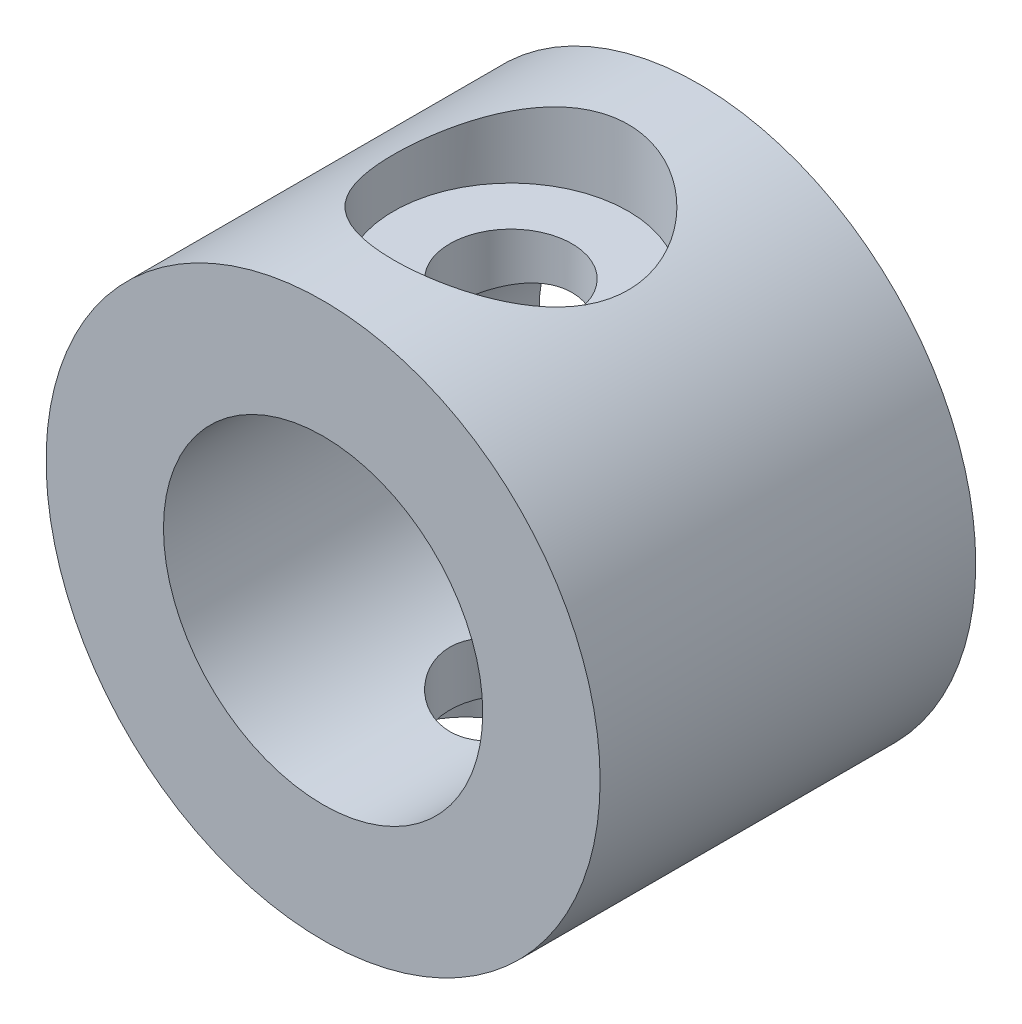
ISO-10303-21;
HEADER;
FILE_DESCRIPTION(('STEP AP214'),'2;1');
FILE_NAME('part.step','',(''),(''),'','','');
FILE_SCHEMA(('AUTOMOTIVE_DESIGN { 1 0 10303 214 1 1 1 1 }'));
ENDSEC;
DATA;
#1=APPLICATION_CONTEXT('core data for automotive mechanical design processes');
#2=APPLICATION_PROTOCOL_DEFINITION('international standard','automotive_design',2000,#1);
#3=PRODUCT_CONTEXT('',#1,'mechanical');
#4=PRODUCT('Part','Part','',(#3));
#5=PRODUCT_RELATED_PRODUCT_CATEGORY('part','',(#4));
#6=PRODUCT_DEFINITION_FORMATION('','',#4);
#7=PRODUCT_DEFINITION_CONTEXT('part definition',#1,'design');
#8=PRODUCT_DEFINITION('design','',#6,#7);
#9=PRODUCT_DEFINITION_SHAPE('','',#8);
#10=(LENGTH_UNIT() NAMED_UNIT(*) SI_UNIT(.MILLI.,.METRE.));
#11=(NAMED_UNIT(*) PLANE_ANGLE_UNIT() SI_UNIT($,.RADIAN.));
#12=(NAMED_UNIT(*) SI_UNIT($,.STERADIAN.) SOLID_ANGLE_UNIT());
#13=UNCERTAINTY_MEASURE_WITH_UNIT(LENGTH_MEASURE(1.E-05),#10,'distance_accuracy_value','');
#14=(GEOMETRIC_REPRESENTATION_CONTEXT(3) GLOBAL_UNCERTAINTY_ASSIGNED_CONTEXT((#13)) GLOBAL_UNIT_ASSIGNED_CONTEXT((#10,
#11,#12)) REPRESENTATION_CONTEXT('',''));
#15=CARTESIAN_POINT('',(0.,0.,0.));
#16=DIRECTION('',(0.,0.,1.));
#17=DIRECTION('',(1.,0.,0.));
#18=AXIS2_PLACEMENT_3D('',#15,#16,#17);
#19=CARTESIAN_POINT('',(0.,0.,8.));
#20=DIRECTION('',(0.,0.,1.));
#21=DIRECTION('',(1.,0.,0.));
#22=AXIS2_PLACEMENT_3D('',#19,#20,#21);
#23=PLANE('',#22);
#24=CARTESIAN_POINT('',(0.,0.,8.));
#25=DIRECTION('',(0.,0.,1.));
#26=DIRECTION('',(1.,0.,0.));
#27=AXIS2_PLACEMENT_3D('',#24,#25,#26);
#28=CIRCLE('',#27,5.9);
#29=CARTESIAN_POINT('',(5.9,0.,8.));
#30=VERTEX_POINT('',#29);
#31=EDGE_CURVE('E48',#30,#30,#28,.T.);
#32=ORIENTED_EDGE('',*,*,#31,.T.);
#33=EDGE_LOOP('',(#32));
#34=FACE_BOUND('',#33,.T.);
#35=CARTESIAN_POINT('',(0.,0.,8.));
#36=DIRECTION('',(0.,0.,1.));
#37=DIRECTION('',(1.,0.,0.));
#38=AXIS2_PLACEMENT_3D('',#35,#36,#37);
#39=CIRCLE('',#38,3.4);
#40=CARTESIAN_POINT('',(3.4,0.,8.));
#41=VERTEX_POINT('',#40);
#42=EDGE_CURVE('E85',#41,#41,#39,.T.);
#43=ORIENTED_EDGE('',*,*,#42,.F.);
#44=EDGE_LOOP('',(#43));
#45=FACE_BOUND('',#44,.T.);
#46=ADVANCED_FACE('F31',(#34,#45),#23,.T.);
#47=CARTESIAN_POINT('',(0.,0.,0.));
#48=DIRECTION('',(0.,0.,1.));
#49=DIRECTION('',(1.,0.,0.));
#50=AXIS2_PLACEMENT_3D('',#47,#48,#49);
#51=PLANE('',#50);
#52=CARTESIAN_POINT('',(0.,0.,0.));
#53=DIRECTION('',(0.,0.,1.));
#54=DIRECTION('',(1.,0.,0.));
#55=AXIS2_PLACEMENT_3D('',#52,#53,#54);
#56=CIRCLE('',#55,5.9);
#57=CARTESIAN_POINT('',(5.9,0.,0.));
#58=VERTEX_POINT('',#57);
#59=EDGE_CURVE('E82',#58,#58,#56,.T.);
#60=ORIENTED_EDGE('',*,*,#59,.F.);
#61=EDGE_LOOP('',(#60));
#62=FACE_BOUND('',#61,.T.);
#63=CARTESIAN_POINT('',(0.,0.,0.));
#64=DIRECTION('',(0.,0.,1.));
#65=DIRECTION('',(1.,0.,0.));
#66=AXIS2_PLACEMENT_3D('',#63,#64,#65);
#67=CIRCLE('',#66,3.4);
#68=CARTESIAN_POINT('',(3.4,0.,0.));
#69=VERTEX_POINT('',#68);
#70=EDGE_CURVE('E88',#69,#69,#67,.T.);
#71=ORIENTED_EDGE('',*,*,#70,.T.);
#72=EDGE_LOOP('',(#71));
#73=FACE_BOUND('',#72,.T.);
#74=ADVANCED_FACE('F121',(#62,#73),#51,.F.);
#75=CARTESIAN_POINT('',(0.,0.,8.));
#76=DIRECTION('',(0.,0.,-1.));
#77=DIRECTION('',(-1.,0.,0.));
#78=AXIS2_PLACEMENT_3D('',#75,#76,#77);
#79=CYLINDRICAL_SURFACE('',#78,5.9);
#80=CARTESIAN_POINT('',(0.,-5.9,1.5));
#81=CARTESIAN_POINT('',(-0.133704964672586,-5.89999539975091,1.5000058234451));
#82=CARTESIAN_POINT('',(-0.267638901281597,-5.89540334321828,1.51078972456949));
#83=CARTESIAN_POINT('',(-0.531686826948365,-5.87749259551177,1.55351592543075));
#84=CARTESIAN_POINT('',(-0.661790144428239,-5.86415156573512,1.58551238913156));
#85=CARTESIAN_POINT('',(-0.913940644210926,-5.83016639965286,1.6692718372477));
#86=CARTESIAN_POINT('',(-1.03601382516124,-5.80954736341634,1.7209669340223));
#87=CARTESIAN_POINT('',(-1.26963264405531,-5.76300612955336,1.8423682881944));
#88=CARTESIAN_POINT('',(-1.38118125916974,-5.73708543826198,1.91206943109243));
#89=CARTESIAN_POINT('',(-1.59651817106512,-5.68102879724399,2.07129714951707));
#90=CARTESIAN_POINT('',(-1.69969303104001,-5.65075176642193,2.16160321480173));
#91=CARTESIAN_POINT('',(-1.8899640072564,-5.58999386580978,2.35782752695448));
#92=CARTESIAN_POINT('',(-1.97705138747107,-5.55951289452794,2.46375420050925));
#93=CARTESIAN_POINT('',(-2.13709462619903,-5.50004505417565,2.69479354640178));
#94=CARTESIAN_POINT('',(-2.20909662973242,-5.47121499310551,2.82061159365557));
#95=CARTESIAN_POINT('',(-2.33064116406356,-5.42056083698699,3.08396940474092));
#96=CARTESIAN_POINT('',(-2.3801956541013,-5.39873301320789,3.22150288049487));
#97=CARTESIAN_POINT('',(-2.45288327698176,-5.36608701412312,3.49732548254046));
#98=CARTESIAN_POINT('',(-2.47719925100343,-5.35477882345067,3.63524260936203));
#99=CARTESIAN_POINT('',(-2.5024073197555,-5.34304891755339,3.91362722151472));
#100=CARTESIAN_POINT('',(-2.50331297556624,-5.34262089968713,4.05409318316441));
#101=CARTESIAN_POINT('',(-2.48256336049047,-5.35228644659235,4.32161617055171));
#102=CARTESIAN_POINT('',(-2.4627025809086,-5.36154316291892,4.44884877806482));
#103=CARTESIAN_POINT('',(-2.40400167454297,-5.3881168191821,4.69796842300373));
#104=CARTESIAN_POINT('',(-2.36515776468436,-5.40543536569708,4.81985438963963));
#105=CARTESIAN_POINT('',(-2.26883070129111,-5.44657603145346,5.05795253178553));
#106=CARTESIAN_POINT('',(-2.21096284909565,-5.47053062034435,5.17398514823833));
#107=CARTESIAN_POINT('',(-2.07850355612712,-5.52221598600458,5.39515439056438));
#108=CARTESIAN_POINT('',(-2.00390539673649,-5.54994827807618,5.50028661414626));
#109=CARTESIAN_POINT('',(-1.83242814186108,-5.60902122141942,5.70637377125554));
#110=CARTESIAN_POINT('',(-1.73416890140161,-5.64046504739879,5.80615409100292));
#111=CARTESIAN_POINT('',(-1.52201112840676,-5.70137305807578,5.98822222337428));
#112=CARTESIAN_POINT('',(-1.40810869165618,-5.73083674582958,6.07050565603506));
#113=CARTESIAN_POINT('',(-1.16422417889566,-5.78537407482597,6.21704782637199));
#114=CARTESIAN_POINT('',(-1.03391535889474,-5.81032182708302,6.28081312152926));
#115=CARTESIAN_POINT('',(-0.763092580703262,-5.85204339288472,6.385101847547));
#116=CARTESIAN_POINT('',(-0.622584512442175,-5.86882188159139,6.42563857416719));
#117=CARTESIAN_POINT('',(-0.3451544221524,-5.8914318291442,6.47982477505773));
#118=CARTESIAN_POINT('',(-0.208592262511964,-5.89790354286186,6.49504963467179));
#119=CARTESIAN_POINT('',(0.0652785683328544,-5.90122613678829,6.50289606265336));
#120=CARTESIAN_POINT('',(0.202587003487469,-5.89807990040911,6.49552440533877));
#121=CARTESIAN_POINT('',(0.466571516947615,-5.88293333586752,6.45950083022525));
#122=CARTESIAN_POINT('',(0.593430264007493,-5.87139920919387,6.43196889052793));
#123=CARTESIAN_POINT('',(0.840580673605039,-5.84114161827264,6.35798023578657));
#124=CARTESIAN_POINT('',(0.960871511531733,-5.82241725363961,6.31152115057818));
#125=CARTESIAN_POINT('',(1.19571108463385,-5.77883981744612,6.19948403870959));
#126=CARTESIAN_POINT('',(1.30996384315592,-5.75381385946635,6.133355060361));
#127=CARTESIAN_POINT('',(1.52616176330887,-5.70028547490212,5.98445886906334));
#128=CARTESIAN_POINT('',(1.62810168521517,-5.67178157858135,5.90168461237042));
#129=CARTESIAN_POINT('',(1.82469243507812,-5.61175805661168,5.71470936436581));
#130=CARTESIAN_POINT('',(1.91825041996665,-5.58017109880818,5.60937802949427));
#131=CARTESIAN_POINT('',(2.08668313219431,-5.51940129227753,5.38403260799288));
#132=CARTESIAN_POINT('',(2.16155306403031,-5.4902190619068,5.26401476443815));
#133=CARTESIAN_POINT('',(2.29145182539148,-5.43730350588712,5.00991407421344));
#134=CARTESIAN_POINT('',(2.34613525687956,-5.4136673528999,4.87563290193898));
#135=CARTESIAN_POINT('',(2.43163459624991,-5.37581433799652,4.59844826890426));
#136=CARTESIAN_POINT('',(2.46247109552343,-5.36158935124716,4.45555236201639));
#137=CARTESIAN_POINT('',(2.49732222272223,-5.34543887503271,4.17736296483277));
#138=CARTESIAN_POINT('',(2.50326415604511,-5.34263012416882,4.04236126222007));
#139=CARTESIAN_POINT('',(2.49333867582406,-5.34726978836135,3.77335595645444));
#140=CARTESIAN_POINT('',(2.47747489636737,-5.3547164942686,3.63935219072956));
#141=CARTESIAN_POINT('',(2.42602534881031,-5.3782090327067,3.38303450658959));
#142=CARTESIAN_POINT('',(2.3914606094019,-5.39380836632267,3.26047073205028));
#143=CARTESIAN_POINT('',(2.30460795944894,-5.43148331538415,3.02286389499454));
#144=CARTESIAN_POINT('',(2.25231503396178,-5.45356076311825,2.90782297153598));
#145=CARTESIAN_POINT('',(2.12780712968082,-5.50337967886083,2.68083108100408));
#146=CARTESIAN_POINT('',(2.05456820548802,-5.53138522124817,2.56950082961975));
#147=CARTESIAN_POINT('',(1.89165766660172,-5.58919486091607,2.36010809150506));
#148=CARTESIAN_POINT('',(1.80198004622459,-5.61899961283883,2.26205047661063));
#149=CARTESIAN_POINT('',(1.6006003280644,-5.67978363034554,2.07427008859748));
#150=CARTESIAN_POINT('',(1.48773900159791,-5.71067865829118,1.98575646499252));
#151=CARTESIAN_POINT('',(1.24766991390656,-5.76788998412644,1.8288477260063));
#152=CARTESIAN_POINT('',(1.12045567757481,-5.7942042017274,1.76046174152596));
#153=CARTESIAN_POINT('',(0.85690908963206,-5.83893962786304,1.64714941197378));
#154=CARTESIAN_POINT('',(0.72074756489416,-5.85747627720416,1.60187761750309));
#155=CARTESIAN_POINT('',(0.511877530788227,-5.87817264520304,1.5519146910749));
#156=CARTESIAN_POINT('',(0.441544748382825,-5.88388481912997,1.53825519356756));
#157=CARTESIAN_POINT('',(0.299825804043617,-5.89280273435451,1.51701329464952));
#158=CARTESIAN_POINT('',(0.228440443174297,-5.89601029066881,1.50942649244964));
#159=CARTESIAN_POINT('',(0.130750752549894,-5.89860900890774,1.50328424318549));
#160=CARTESIAN_POINT('',(0.104619195254891,-5.8991301301922,1.50205327158543));
#161=CARTESIAN_POINT('',(0.0523280156759135,-5.8998260767358,1.50041057817083));
#162=CARTESIAN_POINT('',(0.0261683932591358,-5.90000090034897,1.49999886025024));
#163=CARTESIAN_POINT('',(0.,-5.9,1.5));
#164=B_SPLINE_CURVE_WITH_KNOTS('',3,(#80,#81,#82,#83,#84,#85,#86,#87,#88,#89,#90,#91,#92,#93,
#94,#95,#96,#97,#98,#99,#100,#101,#102,#103,#104,#105,#106,#107,#108,#109,#110,#111,#112,#113,
#114,#115,#116,#117,#118,#119,#120,#121,#122,#123,#124,#125,#126,#127,#128,#129,#130,#131,#132,
#133,#134,#135,#136,#137,#138,#139,#140,#141,#142,#143,#144,#145,#146,#147,#148,#149,#150,#151,
#152,#153,#154,#155,#156,#157,#158,#159,#160,#161,#162,#163),.UNSPECIFIED.,.T.,.F.,(4,2,2,2,2,2,
2,2,2,2,2,2,2,2,2,2,2,2,2,2,2,2,2,2,2,2,2,2,2,2,2,2,2,2,2,2,2,2,2,2,2,4),(0.,0.401012155218539,
0.803052215326141,1.20371907079431,1.60427224436101,2.0237016719916,2.44335819822093,
2.88453802682298,3.32548253320073,3.74467393752972,4.16362250809056,4.54914091507956,
4.93473618189443,5.32866517195721,5.72275264162534,6.1513957104709,6.58014595474843,
7.01944812402802,7.45849859008767,7.86903145748405,8.27944126130657,8.66863129555448,
9.05787008137065,9.45924509890238,9.86079032414974,10.291964162133,10.7232485292704,
11.1616033862626,11.5995793078789,12.0029386061657,12.406230689719,12.7894477096556,
13.1727732244579,13.5795745857473,13.9865248643927,14.4245663053443,14.8628061585292,
15.2942891263342,15.5096641286141,15.7248829102629,15.8033676092252,15.881852681228),.UNSPECIFIED.);
#165=CARTESIAN_POINT('',(0.,-5.9,1.5));
#166=VERTEX_POINT('',#165);
#167=EDGE_CURVE('E10',#166,#166,#164,.T.);
#168=ORIENTED_EDGE('',*,*,#167,.T.);
#169=EDGE_LOOP('',(#168));
#170=FACE_BOUND('',#169,.T.);
#171=CARTESIAN_POINT('',(0.,5.9,6.5));
#172=CARTESIAN_POINT('',(-0.133704964672586,5.89999539975091,6.4999941765549));
#173=CARTESIAN_POINT('',(-0.267638901281597,5.89540334321828,6.48921027543051));
#174=CARTESIAN_POINT('',(-0.531686826948365,5.87749259551178,6.44648407456925));
#175=CARTESIAN_POINT('',(-0.661790144428239,5.86415156573512,6.41448761086844));
#176=CARTESIAN_POINT('',(-0.913940644210926,5.83016639965286,6.3307281627523));
#177=CARTESIAN_POINT('',(-1.03601382516125,5.80954736341634,6.2790330659777));
#178=CARTESIAN_POINT('',(-1.26963264405531,5.76300612955336,6.1576317118056));
#179=CARTESIAN_POINT('',(-1.38118125916974,5.73708543826198,6.08793056890757));
#180=CARTESIAN_POINT('',(-1.59651817106511,5.68102879724399,5.92870285048293));
#181=CARTESIAN_POINT('',(-1.69969303104001,5.65075176642193,5.83839678519827));
#182=CARTESIAN_POINT('',(-1.8899640072564,5.58999386580978,5.64217247304552));
#183=CARTESIAN_POINT('',(-1.97705138747107,5.55951289452794,5.53624579949075));
#184=CARTESIAN_POINT('',(-2.13709462619903,5.50004505417565,5.30520645359822));
#185=CARTESIAN_POINT('',(-2.20909662973242,5.4712149931055,5.17938840634443));
#186=CARTESIAN_POINT('',(-2.33064116406356,5.42056083698699,4.91603059525908));
#187=CARTESIAN_POINT('',(-2.3801956541013,5.39873301320789,4.77849711950513));
#188=CARTESIAN_POINT('',(-2.45288327698176,5.36608701412312,4.50267451745954));
#189=CARTESIAN_POINT('',(-2.47719925100343,5.35477882345067,4.36475739063797));
#190=CARTESIAN_POINT('',(-2.50240731975551,5.34304891755339,4.08637277848528));
#191=CARTESIAN_POINT('',(-2.50331297556624,5.34262089968713,3.9459068168356));
#192=CARTESIAN_POINT('',(-2.48256336049047,5.35228644659235,3.67838382944829));
#193=CARTESIAN_POINT('',(-2.4627025809086,5.36154316291892,3.55115122193518));
#194=CARTESIAN_POINT('',(-2.40400167454297,5.38811681918209,3.30203157699628));
#195=CARTESIAN_POINT('',(-2.36515776468436,5.40543536569708,3.18014561036037));
#196=CARTESIAN_POINT('',(-2.26883070129111,5.44657603145346,2.94204746821447));
#197=CARTESIAN_POINT('',(-2.21096284909566,5.47053062034435,2.82601485176167));
#198=CARTESIAN_POINT('',(-2.07850355612713,5.52221598600458,2.60484560943563));
#199=CARTESIAN_POINT('',(-2.00390539673649,5.54994827807618,2.49971338585375));
#200=CARTESIAN_POINT('',(-1.83242814186109,5.60902122141942,2.29362622874446));
#201=CARTESIAN_POINT('',(-1.73416890140162,5.64046504739879,2.19384590899708));
#202=CARTESIAN_POINT('',(-1.52201112840676,5.70137305807578,2.01177777662572));
#203=CARTESIAN_POINT('',(-1.40810869165618,5.73083674582958,1.92949434396494));
#204=CARTESIAN_POINT('',(-1.16422417889567,5.78537407482596,1.78295217362802));
#205=CARTESIAN_POINT('',(-1.03391535889474,5.81032182708302,1.71918687847074));
#206=CARTESIAN_POINT('',(-0.763092580703267,5.85204339288472,1.614898152453));
#207=CARTESIAN_POINT('',(-0.62258451244218,5.86882188159138,1.57436142583281));
#208=CARTESIAN_POINT('',(-0.345154422152405,5.8914318291442,1.52017522494227));
#209=CARTESIAN_POINT('',(-0.208592262511968,5.89790354286186,1.50495036532821));
#210=CARTESIAN_POINT('',(0.0652785683328502,5.90122613678829,1.49710393734664));
#211=CARTESIAN_POINT('',(0.202587003487465,5.89807990040911,1.50447559466123));
#212=CARTESIAN_POINT('',(0.466571516947611,5.88293333586752,1.54049916977475));
#213=CARTESIAN_POINT('',(0.593430264007489,5.87139920919387,1.56803110947207));
#214=CARTESIAN_POINT('',(0.840580673605035,5.84114161827264,1.64201976421343));
#215=CARTESIAN_POINT('',(0.960871511531729,5.82241725363961,1.68847884942182));
#216=CARTESIAN_POINT('',(1.19571108463385,5.77883981744612,1.80051596129041));
#217=CARTESIAN_POINT('',(1.30996384315591,5.75381385946635,1.866644939639));
#218=CARTESIAN_POINT('',(1.52616176330887,5.70028547490213,2.01554113093666));
#219=CARTESIAN_POINT('',(1.62810168521517,5.67178157858135,2.09831538762958));
#220=CARTESIAN_POINT('',(1.82469243507812,5.61175805661168,2.28529063563419));
#221=CARTESIAN_POINT('',(1.91825041996665,5.58017109880819,2.39062197050573));
#222=CARTESIAN_POINT('',(2.08668313219431,5.51940129227753,2.61596739200712));
#223=CARTESIAN_POINT('',(2.16155306403031,5.4902190619068,2.73598523556185));
#224=CARTESIAN_POINT('',(2.29145182539148,5.43730350588712,2.99008592578656));
#225=CARTESIAN_POINT('',(2.34613525687955,5.4136673528999,3.12436709806102));
#226=CARTESIAN_POINT('',(2.43163459624991,5.37581433799653,3.40155173109573));
#227=CARTESIAN_POINT('',(2.46247109552342,5.36158935124717,3.5444476379836));
#228=CARTESIAN_POINT('',(2.49732222272223,5.34543887503271,3.82263703516723));
#229=CARTESIAN_POINT('',(2.50326415604511,5.34263012416882,3.95763873777992));
#230=CARTESIAN_POINT('',(2.49333867582406,5.34726978836135,4.22664404354556));
#231=CARTESIAN_POINT('',(2.47747489636737,5.3547164942686,4.36064780927044));
#232=CARTESIAN_POINT('',(2.42602534881031,5.3782090327067,4.61696549341041));
#233=CARTESIAN_POINT('',(2.3914606094019,5.39380836632267,4.73952926794972));
#234=CARTESIAN_POINT('',(2.30460795944894,5.43148331538415,4.97713610500546));
#235=CARTESIAN_POINT('',(2.25231503396178,5.45356076311824,5.09217702846402));
#236=CARTESIAN_POINT('',(2.12780712968082,5.50337967886083,5.31916891899592));
#237=CARTESIAN_POINT('',(2.05456820548802,5.53138522124817,5.43049917038024));
#238=CARTESIAN_POINT('',(1.89165766660172,5.58919486091607,5.63989190849494));
#239=CARTESIAN_POINT('',(1.80198004622459,5.61899961283883,5.73794952338937));
#240=CARTESIAN_POINT('',(1.6006003280644,5.67978363034553,5.92572991140252));
#241=CARTESIAN_POINT('',(1.48773900159792,5.71067865829118,6.01424353500748));
#242=CARTESIAN_POINT('',(1.24766991390657,5.76788998412644,6.1711522739937));
#243=CARTESIAN_POINT('',(1.12045567757482,5.7942042017274,6.23953825847404));
#244=CARTESIAN_POINT('',(0.856909089632063,5.83893962786304,6.35285058802622));
#245=CARTESIAN_POINT('',(0.720747564894164,5.85747627720416,6.39812238249691));
#246=CARTESIAN_POINT('',(0.511877530788231,5.87817264520304,6.44808530892509));
#247=CARTESIAN_POINT('',(0.441544748382828,5.88388481912997,6.46174480643244));
#248=CARTESIAN_POINT('',(0.29982580404362,5.89280273435451,6.48298670535047));
#249=CARTESIAN_POINT('',(0.2284404431743,5.89601029066881,6.49057350755036));
#250=CARTESIAN_POINT('',(0.130750752549895,5.89860900890774,6.49671575681451));
#251=CARTESIAN_POINT('',(0.104619195254891,5.8991301301922,6.49794672841457));
#252=CARTESIAN_POINT('',(0.0523280156759131,5.8998260767358,6.49958942182917));
#253=CARTESIAN_POINT('',(0.0261683932591356,5.90000090034897,6.50000113974976));
#254=CARTESIAN_POINT('',(0.,5.9,6.5));
#255=B_SPLINE_CURVE_WITH_KNOTS('',3,(#171,#172,#173,#174,#175,#176,#177,#178,#179,#180,#181,
#182,#183,#184,#185,#186,#187,#188,#189,#190,#191,#192,#193,#194,#195,#196,#197,#198,#199,#200,
#201,#202,#203,#204,#205,#206,#207,#208,#209,#210,#211,#212,#213,#214,#215,#216,#217,#218,#219,
#220,#221,#222,#223,#224,#225,#226,#227,#228,#229,#230,#231,#232,#233,#234,#235,#236,#237,#238,
#239,#240,#241,#242,#243,#244,#245,#246,#247,#248,#249,#250,#251,#252,#253,#254),.UNSPECIFIED.,
.T.,.F.,(4,2,2,2,2,2,2,2,2,2,2,2,2,2,2,2,2,2,2,2,2,2,2,2,2,2,2,2,2,2,2,2,2,2,2,2,2,2,2,2,2,4),
(0.,0.401012155218539,0.803052215326141,1.20371907079431,1.60427224436101,2.0237016719916,
2.44335819822093,2.88453802682298,3.32548253320073,3.74467393752972,4.16362250809056,
4.54914091507956,4.93473618189443,5.32866517195721,5.72275264162534,6.1513957104709,
6.58014595474842,7.01944812402802,7.45849859008767,7.86903145748405,8.27944126130657,
8.66863129555448,9.05787008137064,9.45924509890238,9.86079032414974,10.291964162133,
10.7232485292704,11.1616033862626,11.5995793078789,12.0029386061657,12.406230689719,
12.7894477096556,13.1727732244579,13.5795745857473,13.9865248643927,14.4245663053443,
14.8628061585292,15.2942891263342,15.5096641286141,15.7248829102629,15.8033676092252,
15.881852681228),.UNSPECIFIED.);
#256=CARTESIAN_POINT('',(0.,5.9,6.5));
#257=VERTEX_POINT('',#256);
#258=EDGE_CURVE('E44',#257,#257,#255,.T.);
#259=ORIENTED_EDGE('',*,*,#258,.T.);
#260=EDGE_LOOP('',(#259));
#261=FACE_BOUND('',#260,.T.);
#262=ORIENTED_EDGE('',*,*,#31,.F.);
#263=EDGE_LOOP('',(#262));
#264=FACE_BOUND('',#263,.T.);
#265=ORIENTED_EDGE('',*,*,#59,.T.);
#266=EDGE_LOOP('',(#265));
#267=FACE_BOUND('',#266,.T.);
#268=ADVANCED_FACE('F33',(#170,#261,#264,#267),#79,.T.);
#269=CARTESIAN_POINT('',(0.,0.,8.));
#270=DIRECTION('',(0.,0.,-1.));
#271=DIRECTION('',(-1.,0.,0.));
#272=AXIS2_PLACEMENT_3D('',#269,#270,#271);
#273=CYLINDRICAL_SURFACE('',#272,3.4);
#274=CARTESIAN_POINT('',(0.,-3.4,2.7));
#275=CARTESIAN_POINT('',(-0.0703050646487782,-3.40000227934561,2.69999699869852));
#276=CARTESIAN_POINT('',(-0.140590003338292,-3.39780060572003,2.70572089035486));
#277=CARTESIAN_POINT('',(-0.279054037846009,-3.38923843055045,2.72836818376442));
#278=CARTESIAN_POINT('',(-0.347233525044064,-3.38287870687431,2.74528949076654));
#279=CARTESIAN_POINT('',(-0.479469306737702,-3.36668145803788,2.78964206524634));
#280=CARTESIAN_POINT('',(-0.543533456836366,-3.35685080656631,2.8170525692609));
#281=CARTESIAN_POINT('',(-0.666147899344888,-3.3346864622569,2.88149766629924));
#282=CARTESIAN_POINT('',(-0.724696646983225,-3.32235207119741,2.91853494476607));
#283=CARTESIAN_POINT('',(-0.837188356258301,-3.29584409218327,3.00287834853146));
#284=CARTESIAN_POINT('',(-0.890857448130563,-3.28161704543611,3.05053277526407));
#285=CARTESIAN_POINT('',(-0.989664643642496,-3.25318491530425,3.15401834943847));
#286=CARTESIAN_POINT('',(-1.03479998366941,-3.23897984050712,3.20985213537091));
#287=CARTESIAN_POINT('',(-1.11703467519467,-3.21157136198829,3.33082761533339));
#288=CARTESIAN_POINT('',(-1.15374125477209,-3.198430590952,3.39625192368118));
#289=CARTESIAN_POINT('',(-1.21550770618724,-3.17547397060102,3.53292625834558));
#290=CARTESIAN_POINT('',(-1.24057243993588,-3.16565673376491,3.60417383808058));
#291=CARTESIAN_POINT('',(-1.27725272362803,-3.15103201967035,3.74731499052276));
#292=CARTESIAN_POINT('',(-1.2893924085612,-3.14603016499681,3.81905370648715));
#293=CARTESIAN_POINT('',(-1.30151647400042,-3.1410352202548,3.96371101409673));
#294=CARTESIAN_POINT('',(-1.30150613328424,-3.14103995499141,4.03662907958432));
#295=CARTESIAN_POINT('',(-1.28973014862173,-3.14589058202643,4.17671227883537));
#296=CARTESIAN_POINT('',(-1.27870056125351,-3.15043334409149,4.24395175921214));
#297=CARTESIAN_POINT('',(-1.24641901835421,-3.16334295223987,4.37554086321392));
#298=CARTESIAN_POINT('',(-1.2251654603917,-3.17171039776625,4.43989003210314));
#299=CARTESIAN_POINT('',(-1.17264886462995,-3.19150314293466,4.56534041052968));
#300=CARTESIAN_POINT('',(-1.14119985056895,-3.20298455368187,4.62635452166853));
#301=CARTESIAN_POINT('',(-1.06931493445421,-3.22769382291609,4.74244947732204));
#302=CARTESIAN_POINT('',(-1.0288758447385,-3.24092230019334,4.79752820698433));
#303=CARTESIAN_POINT('',(-0.936823017515743,-3.26876570685853,4.90425043495254));
#304=CARTESIAN_POINT('',(-0.884624716518553,-3.28341282687496,4.95538259018867));
#305=CARTESIAN_POINT('',(-0.772229005892806,-3.31164863920904,5.04832291279794));
#306=CARTESIAN_POINT('',(-0.712030270259958,-3.32523715547861,5.09012953145917));
#307=CARTESIAN_POINT('',(-0.583996294112149,-3.35011422813103,5.16382621877911));
#308=CARTESIAN_POINT('',(-0.516050624992801,-3.36136073817027,5.19553964890132));
#309=CARTESIAN_POINT('',(-0.375250881878489,-3.37997307907286,5.24691436902049));
#310=CARTESIAN_POINT('',(-0.302399095251245,-3.38734070444389,5.26658123286979));
#311=CARTESIAN_POINT('',(-0.158153708133313,-3.39704633753882,5.29230682477943));
#312=CARTESIAN_POINT('',(-0.0868998345367058,-3.3996383975945,5.29905372256457));
#313=CARTESIAN_POINT('',(0.0557612336850473,-3.40029030713716,5.30075980706295));
#314=CARTESIAN_POINT('',(0.127168388853128,-3.39835120920733,5.29572173141272));
#315=CARTESIAN_POINT('',(0.265093478293417,-3.39032598871475,5.2745192200597));
#316=CARTESIAN_POINT('',(0.331692500727122,-3.38441001998037,5.25881103593712));
#317=CARTESIAN_POINT('',(0.46125867742513,-3.36919852882021,5.21732071128405));
#318=CARTESIAN_POINT('',(0.524225359032764,-3.35990256771871,5.19153726309272));
#319=CARTESIAN_POINT('',(0.646844153331062,-3.33850020559823,5.12979862984385));
#320=CARTESIAN_POINT('',(0.706341620606955,-3.32631832323757,5.09356327956677));
#321=CARTESIAN_POINT('',(0.818614179324437,-3.30048405894327,5.0122643038403));
#322=CARTESIAN_POINT('',(0.871386709329985,-3.2868311203369,4.96719733103511));
#323=CARTESIAN_POINT('',(0.972045292174109,-3.25853121203601,4.86631725061357));
#324=CARTESIAN_POINT('',(1.01944430154119,-3.24387397478732,4.81001978122327));
#325=CARTESIAN_POINT('',(1.10422529352988,-3.21600430988262,4.68998936906212));
#326=CARTESIAN_POINT('',(1.14160617811259,-3.20279204069652,4.62625561233323));
#327=CARTESIAN_POINT('',(1.20538021904045,-3.17934357038346,4.49251826435898));
#328=CARTESIAN_POINT('',(1.2317104061072,-3.16912452235714,4.42248143133641));
#329=CARTESIAN_POINT('',(1.27202148933743,-3.1531635589904,4.27846550389432));
#330=CARTESIAN_POINT('',(1.28601044224104,-3.14741872303323,4.20448901490691));
#331=CARTESIAN_POINT('',(1.30050711872048,-3.14145458065056,4.0599944860929));
#332=CARTESIAN_POINT('',(1.3018496087557,-3.14089317942914,3.98957367186106));
#333=CARTESIAN_POINT('',(1.29316938914673,-3.14447684950244,3.84956489455342));
#334=CARTESIAN_POINT('',(1.28314784863686,-3.14862143664396,3.77997684654668));
#335=CARTESIAN_POINT('',(1.25268356358223,-3.16086030110073,3.64594643007232));
#336=CARTESIAN_POINT('',(1.2325955919435,-3.16881974053606,3.58141003757476));
#337=CARTESIAN_POINT('',(1.18288664271686,-3.18770805174523,3.45658914355378));
#338=CARTESIAN_POINT('',(1.1532632115154,-3.19863768768132,3.39630574125986));
#339=CARTESIAN_POINT('',(1.08347390185794,-3.2229672825809,3.27816792125006));
#340=CARTESIAN_POINT('',(1.04282594140104,-3.23646862260719,3.22061944803615));
#341=CARTESIAN_POINT('',(0.952875430604815,-3.26408335645724,3.11289441765981));
#342=CARTESIAN_POINT('',(0.903570074991675,-3.27819694755045,3.06272025972264));
#343=CARTESIAN_POINT('',(0.794339263877197,-3.30641488250807,2.96823946987531));
#344=CARTESIAN_POINT('',(0.733967912798968,-3.32047260306389,2.92443202852242));
#345=CARTESIAN_POINT('',(0.606224241122151,-3.3461521043756,2.84759019093602));
#346=CARTESIAN_POINT('',(0.538850898949126,-3.35777352893314,2.81455736961259));
#347=CARTESIAN_POINT('',(0.394701923416041,-3.37784044925138,2.75881973383008));
#348=CARTESIAN_POINT('',(0.317604628932383,-3.38605331670193,2.73685425419496));
#349=CARTESIAN_POINT('',(0.160328346409542,-3.39713030825446,2.70745013006074));
#350=CARTESIAN_POINT('',(0.0801510942727715,-3.39999740143835,2.70000342162544));
#351=CARTESIAN_POINT('',(0.,-3.4,2.7));
#352=B_SPLINE_CURVE_WITH_KNOTS('',3,(#274,#275,#276,#277,#278,#279,#280,#281,#282,#283,#284,
#285,#286,#287,#288,#289,#290,#291,#292,#293,#294,#295,#296,#297,#298,#299,#300,#301,#302,#303,
#304,#305,#306,#307,#308,#309,#310,#311,#312,#313,#314,#315,#316,#317,#318,#319,#320,#321,#322,
#323,#324,#325,#326,#327,#328,#329,#330,#331,#332,#333,#334,#335,#336,#337,#338,#339,#340,#341,
#342,#343,#344,#345,#346,#347,#348,#349,#350,#351),.UNSPECIFIED.,.T.,.F.,(4,2,2,2,2,2,2,2,2,2,2,
2,2,2,2,2,2,2,2,2,2,2,2,2,2,2,2,2,2,2,2,2,2,2,2,2,2,2,4),(0.,0.210619447231137,
0.421199504065061,0.631364854150299,0.841588894083595,1.06013022658546,1.27874221183197,
1.50608207574478,1.73332691158294,1.95095763410599,2.16849380342979,2.37240972775529,
2.57635762281078,2.78425747405756,2.99223115943865,3.21478148722522,3.43736874695214,
3.66366086898945,3.88984820817791,4.1036107656147,4.31732367117278,4.52242993271298,
4.72756282368482,4.93880734912014,5.15013209571541,5.37420917471766,5.59831080370477,
5.82367262232987,6.04888720867259,6.2591225567705,6.46933627776513,6.67261371008487,
6.87594349053771,7.09023015612431,7.30458638603762,7.53119282505044,7.75783237195942,
7.99808196572048,8.23819808331507),.UNSPECIFIED.);
#353=CARTESIAN_POINT('',(0.,-3.4,2.7));
#354=VERTEX_POINT('',#353);
#355=EDGE_CURVE('E36',#354,#354,#352,.T.);
#356=ORIENTED_EDGE('',*,*,#355,.F.);
#357=EDGE_LOOP('',(#356));
#358=FACE_BOUND('',#357,.T.);
#359=CARTESIAN_POINT('',(0.,3.4,5.3));
#360=CARTESIAN_POINT('',(-0.0703050646487799,3.40000227934561,5.30000300130148));
#361=CARTESIAN_POINT('',(-0.140590003338294,3.39780060572003,5.29427910964514));
#362=CARTESIAN_POINT('',(-0.279054037846011,3.38923843055045,5.27163181623558));
#363=CARTESIAN_POINT('',(-0.347233525044066,3.38287870687431,5.25471050923346));
#364=CARTESIAN_POINT('',(-0.479469306737703,3.36668145803788,5.21035793475366));
#365=CARTESIAN_POINT('',(-0.543533456836369,3.35685080656631,5.1829474307391));
#366=CARTESIAN_POINT('',(-0.66614789934489,3.3346864622569,5.11850233370076));
#367=CARTESIAN_POINT('',(-0.724696646983227,3.32235207119741,5.08146505523393));
#368=CARTESIAN_POINT('',(-0.837188356258302,3.29584409218327,4.99712165146854));
#369=CARTESIAN_POINT('',(-0.890857448130565,3.28161704543611,4.94946722473593));
#370=CARTESIAN_POINT('',(-0.989664643642498,3.25318491530425,4.84598165056153));
#371=CARTESIAN_POINT('',(-1.03479998366941,3.23897984050711,4.79014786462909));
#372=CARTESIAN_POINT('',(-1.11703467519467,3.21157136198829,4.66917238466661));
#373=CARTESIAN_POINT('',(-1.15374125477209,3.198430590952,4.60374807631882));
#374=CARTESIAN_POINT('',(-1.21550770618724,3.17547397060102,4.46707374165442));
#375=CARTESIAN_POINT('',(-1.24057243993588,3.16565673376491,4.39582616191942));
#376=CARTESIAN_POINT('',(-1.27725272362804,3.15103201967035,4.25268500947724));
#377=CARTESIAN_POINT('',(-1.2893924085612,3.14603016499681,4.18094629351285));
#378=CARTESIAN_POINT('',(-1.30151647400042,3.1410352202548,4.03628898590327));
#379=CARTESIAN_POINT('',(-1.30150613328424,3.14103995499141,3.96337092041568));
#380=CARTESIAN_POINT('',(-1.28973014862174,3.14589058202643,3.82328772116463));
#381=CARTESIAN_POINT('',(-1.27870056125351,3.15043334409149,3.75604824078786));
#382=CARTESIAN_POINT('',(-1.24641901835421,3.16334295223987,3.62445913678608));
#383=CARTESIAN_POINT('',(-1.2251654603917,3.17171039776625,3.56010996789686));
#384=CARTESIAN_POINT('',(-1.17264886462995,3.19150314293466,3.43465958947032));
#385=CARTESIAN_POINT('',(-1.14119985056895,3.20298455368186,3.37364547833147));
#386=CARTESIAN_POINT('',(-1.06931493445421,3.22769382291609,3.25755052267796));
#387=CARTESIAN_POINT('',(-1.0288758447385,3.24092230019334,3.20247179301568));
#388=CARTESIAN_POINT('',(-0.936823017515745,3.26876570685853,3.09574956504747));
#389=CARTESIAN_POINT('',(-0.884624716518555,3.28341282687496,3.04461740981133));
#390=CARTESIAN_POINT('',(-0.772229005892808,3.31164863920904,2.95167708720206));
#391=CARTESIAN_POINT('',(-0.71203027025996,3.32523715547861,2.90987046854083));
#392=CARTESIAN_POINT('',(-0.583996294112151,3.35011422813103,2.83617378122089));
#393=CARTESIAN_POINT('',(-0.516050624992803,3.36136073817027,2.80446035109868));
#394=CARTESIAN_POINT('',(-0.375250881878491,3.37997307907286,2.75308563097951));
#395=CARTESIAN_POINT('',(-0.302399095251248,3.38734070444389,2.73341876713021));
#396=CARTESIAN_POINT('',(-0.158153708133315,3.39704633753882,2.70769317522057));
#397=CARTESIAN_POINT('',(-0.0868998345367081,3.3996383975945,2.70094627743543));
#398=CARTESIAN_POINT('',(0.0557612336850452,3.40029030713716,2.69924019293705));
#399=CARTESIAN_POINT('',(0.127168388853126,3.39835120920733,2.70427826858728));
#400=CARTESIAN_POINT('',(0.265093478293415,3.39032598871475,2.7254807799403));
#401=CARTESIAN_POINT('',(0.33169250072712,3.38441001998036,2.74118896406288));
#402=CARTESIAN_POINT('',(0.461258677425128,3.36919852882021,2.78267928871595));
#403=CARTESIAN_POINT('',(0.524225359032762,3.35990256771871,2.80846273690729));
#404=CARTESIAN_POINT('',(0.64684415333106,3.33850020559823,2.87020137015615));
#405=CARTESIAN_POINT('',(0.706341620606953,3.32631832323757,2.90643672043323));
#406=CARTESIAN_POINT('',(0.818614179324435,3.30048405894327,2.9877356961597));
#407=CARTESIAN_POINT('',(0.871386709329983,3.2868311203369,3.03280266896489));
#408=CARTESIAN_POINT('',(0.972045292174107,3.25853121203601,3.13368274938643));
#409=CARTESIAN_POINT('',(1.01944430154119,3.24387397478732,3.18998021877673));
#410=CARTESIAN_POINT('',(1.10422529352987,3.21600430988262,3.31001063093788));
#411=CARTESIAN_POINT('',(1.14160617811259,3.20279204069653,3.37374438766677));
#412=CARTESIAN_POINT('',(1.20538021904044,3.17934357038346,3.50748173564102));
#413=CARTESIAN_POINT('',(1.2317104061072,3.16912452235714,3.57751856866359));
#414=CARTESIAN_POINT('',(1.27202148933743,3.1531635589904,3.72153449610568));
#415=CARTESIAN_POINT('',(1.28601044224104,3.14741872303323,3.79551098509309));
#416=CARTESIAN_POINT('',(1.30050711872048,3.14145458065056,3.9400055139071));
#417=CARTESIAN_POINT('',(1.3018496087557,3.14089317942914,4.01042632813894));
#418=CARTESIAN_POINT('',(1.29316938914673,3.14447684950244,4.15043510544658));
#419=CARTESIAN_POINT('',(1.28314784863685,3.14862143664396,4.22002315345332));
#420=CARTESIAN_POINT('',(1.25268356358223,3.16086030110073,4.35405356992768));
#421=CARTESIAN_POINT('',(1.2325955919435,3.16881974053606,4.41858996242524));
#422=CARTESIAN_POINT('',(1.18288664271686,3.18770805174523,4.54341085644622));
#423=CARTESIAN_POINT('',(1.1532632115154,3.19863768768132,4.60369425874014));
#424=CARTESIAN_POINT('',(1.08347390185794,3.2229672825809,4.72183207874994));
#425=CARTESIAN_POINT('',(1.04282594140104,3.23646862260719,4.77938055196385));
#426=CARTESIAN_POINT('',(0.952875430604813,3.26408335645724,4.88710558234019));
#427=CARTESIAN_POINT('',(0.903570074991673,3.27819694755045,4.93727974027736));
#428=CARTESIAN_POINT('',(0.794339263877196,3.30641488250807,5.03176053012469));
#429=CARTESIAN_POINT('',(0.733967912798966,3.32047260306389,5.07556797147758));
#430=CARTESIAN_POINT('',(0.606224241122149,3.3461521043756,5.15240980906398));
#431=CARTESIAN_POINT('',(0.538850898949124,3.35777352893314,5.18544263038742));
#432=CARTESIAN_POINT('',(0.394701923416039,3.37784044925138,5.24118026616992));
#433=CARTESIAN_POINT('',(0.317604628932381,3.38605331670193,5.26314574580504));
#434=CARTESIAN_POINT('',(0.16032834640954,3.39713030825446,5.29254986993926));
#435=CARTESIAN_POINT('',(0.0801510942727698,3.39999740143835,5.29999657837456));
#436=CARTESIAN_POINT('',(0.,3.4,5.3));
#437=B_SPLINE_CURVE_WITH_KNOTS('',3,(#359,#360,#361,#362,#363,#364,#365,#366,#367,#368,#369,
#370,#371,#372,#373,#374,#375,#376,#377,#378,#379,#380,#381,#382,#383,#384,#385,#386,#387,#388,
#389,#390,#391,#392,#393,#394,#395,#396,#397,#398,#399,#400,#401,#402,#403,#404,#405,#406,#407,
#408,#409,#410,#411,#412,#413,#414,#415,#416,#417,#418,#419,#420,#421,#422,#423,#424,#425,#426,
#427,#428,#429,#430,#431,#432,#433,#434,#435,#436),.UNSPECIFIED.,.T.,.F.,(4,2,2,2,2,2,2,2,2,2,2,
2,2,2,2,2,2,2,2,2,2,2,2,2,2,2,2,2,2,2,2,2,2,2,2,2,2,2,4),(0.,0.210619447231137,
0.421199504065061,0.6313648541503,0.841588894083595,1.06013022658546,1.27874221183197,
1.50608207574478,1.73332691158294,1.95095763410599,2.16849380342979,2.37240972775529,
2.57635762281078,2.78425747405756,2.99223115943865,3.21478148722522,3.43736874695214,
3.66366086898944,3.88984820817791,4.1036107656147,4.31732367117278,4.52242993271299,
4.72756282368482,4.93880734912014,5.15013209571541,5.37420917471766,5.59831080370477,
5.82367262232987,6.04888720867259,6.2591225567705,6.46933627776513,6.67261371008487,
6.87594349053772,7.09023015612431,7.30458638603762,7.53119282505044,7.75783237195943,
7.99808196572048,8.23819808331507),.UNSPECIFIED.);
#438=CARTESIAN_POINT('',(0.,3.4,5.3));
#439=VERTEX_POINT('',#438);
#440=EDGE_CURVE('E54',#439,#439,#437,.T.);
#441=ORIENTED_EDGE('',*,*,#440,.F.);
#442=EDGE_LOOP('',(#441));
#443=FACE_BOUND('',#442,.T.);
#444=ORIENTED_EDGE('',*,*,#42,.T.);
#445=EDGE_LOOP('',(#444));
#446=FACE_BOUND('',#445,.T.);
#447=ORIENTED_EDGE('',*,*,#70,.F.);
#448=EDGE_LOOP('',(#447));
#449=FACE_BOUND('',#448,.T.);
#450=ADVANCED_FACE('F77',(#358,#443,#446,#449),#273,.F.);
#451=CARTESIAN_POINT('',(0.,5.9,4.));
#452=DIRECTION('',(0.,1.,0.));
#453=DIRECTION('',(0.,0.,1.));
#454=AXIS2_PLACEMENT_3D('',#451,#452,#453);
#455=CYLINDRICAL_SURFACE('',#454,2.5);
#456=CARTESIAN_POINT('',(0.,4.3,4.));
#457=DIRECTION('',(0.,1.,0.));
#458=DIRECTION('',(0.,0.,1.));
#459=AXIS2_PLACEMENT_3D('',#456,#457,#458);
#460=CIRCLE('',#459,2.5);
#461=CARTESIAN_POINT('',(0.,4.3,6.5));
#462=VERTEX_POINT('',#461);
#463=EDGE_CURVE('E96',#462,#462,#460,.T.);
#464=ORIENTED_EDGE('',*,*,#463,.F.);
#465=EDGE_LOOP('',(#464));
#466=FACE_BOUND('',#465,.T.);
#467=ORIENTED_EDGE('',*,*,#258,.F.);
#468=EDGE_LOOP('',(#467));
#469=FACE_BOUND('',#468,.T.);
#470=ADVANCED_FACE('F72',(#466,#469),#455,.F.);
#471=CARTESIAN_POINT('',(0.,5.9,4.));
#472=DIRECTION('',(0.,1.,0.));
#473=DIRECTION('',(0.,0.,1.));
#474=AXIS2_PLACEMENT_3D('',#471,#472,#473);
#475=CYLINDRICAL_SURFACE('',#474,1.3);
#476=ORIENTED_EDGE('',*,*,#440,.T.);
#477=EDGE_LOOP('',(#476));
#478=FACE_BOUND('',#477,.T.);
#479=CARTESIAN_POINT('',(0.,4.3,4.));
#480=DIRECTION('',(0.,1.,0.));
#481=DIRECTION('',(0.,0.,1.));
#482=AXIS2_PLACEMENT_3D('',#479,#480,#481);
#483=CIRCLE('',#482,1.3);
#484=CARTESIAN_POINT('',(0.,4.3,5.3));
#485=VERTEX_POINT('',#484);
#486=EDGE_CURVE('E93',#485,#485,#483,.T.);
#487=ORIENTED_EDGE('',*,*,#486,.T.);
#488=EDGE_LOOP('',(#487));
#489=FACE_BOUND('',#488,.T.);
#490=ADVANCED_FACE('F76',(#478,#489),#475,.F.);
#491=CARTESIAN_POINT('',(1.3,4.3,4.));
#492=DIRECTION('',(0.,-1.,0.));
#493=DIRECTION('',(0.,0.,-1.));
#494=AXIS2_PLACEMENT_3D('',#491,#492,#493);
#495=PLANE('',#494);
#496=ORIENTED_EDGE('',*,*,#486,.F.);
#497=EDGE_LOOP('',(#496));
#498=FACE_BOUND('',#497,.T.);
#499=ORIENTED_EDGE('',*,*,#463,.T.);
#500=EDGE_LOOP('',(#499));
#501=FACE_BOUND('',#500,.T.);
#502=ADVANCED_FACE('F63',(#498,#501),#495,.F.);
#503=CARTESIAN_POINT('',(0.,-5.9,4.));
#504=DIRECTION('',(0.,-1.,0.));
#505=DIRECTION('',(0.,0.,-1.));
#506=AXIS2_PLACEMENT_3D('',#503,#504,#505);
#507=CYLINDRICAL_SURFACE('',#506,2.5);
#508=CARTESIAN_POINT('',(0.,-4.3,4.));
#509=DIRECTION('',(0.,-1.,0.));
#510=DIRECTION('',(0.,0.,-1.));
#511=AXIS2_PLACEMENT_3D('',#508,#509,#510);
#512=CIRCLE('',#511,2.5);
#513=CARTESIAN_POINT('',(0.,-4.3,1.5));
#514=VERTEX_POINT('',#513);
#515=EDGE_CURVE('E102',#514,#514,#512,.T.);
#516=ORIENTED_EDGE('',*,*,#515,.F.);
#517=EDGE_LOOP('',(#516));
#518=FACE_BOUND('',#517,.T.);
#519=ORIENTED_EDGE('',*,*,#167,.F.);
#520=EDGE_LOOP('',(#519));
#521=FACE_BOUND('',#520,.T.);
#522=ADVANCED_FACE('F58',(#518,#521),#507,.F.);
#523=CARTESIAN_POINT('',(0.,-5.9,4.));
#524=DIRECTION('',(0.,-1.,0.));
#525=DIRECTION('',(0.,0.,-1.));
#526=AXIS2_PLACEMENT_3D('',#523,#524,#525);
#527=CYLINDRICAL_SURFACE('',#526,1.3);
#528=ORIENTED_EDGE('',*,*,#355,.T.);
#529=EDGE_LOOP('',(#528));
#530=FACE_BOUND('',#529,.T.);
#531=CARTESIAN_POINT('',(0.,-4.3,4.));
#532=DIRECTION('',(0.,-1.,0.));
#533=DIRECTION('',(0.,0.,-1.));
#534=AXIS2_PLACEMENT_3D('',#531,#532,#533);
#535=CIRCLE('',#534,1.3);
#536=CARTESIAN_POINT('',(0.,-4.3,2.7));
#537=VERTEX_POINT('',#536);
#538=EDGE_CURVE('E99',#537,#537,#535,.T.);
#539=ORIENTED_EDGE('',*,*,#538,.T.);
#540=EDGE_LOOP('',(#539));
#541=FACE_BOUND('',#540,.T.);
#542=ADVANCED_FACE('F62',(#530,#541),#527,.F.);
#543=CARTESIAN_POINT('',(1.3,-4.3,4.));
#544=DIRECTION('',(0.,1.,0.));
#545=DIRECTION('',(0.,0.,1.));
#546=AXIS2_PLACEMENT_3D('',#543,#544,#545);
#547=PLANE('',#546);
#548=ORIENTED_EDGE('',*,*,#538,.F.);
#549=EDGE_LOOP('',(#548));
#550=FACE_BOUND('',#549,.T.);
#551=ORIENTED_EDGE('',*,*,#515,.T.);
#552=EDGE_LOOP('',(#551));
#553=FACE_BOUND('',#552,.T.);
#554=ADVANCED_FACE('F65',(#550,#553),#547,.F.);
#555=CLOSED_SHELL('',(#46,#74,#268,#450,#470,#490,#502,#522,#542,#554));
#556=MANIFOLD_SOLID_BREP('B2',#555);
#557=ADVANCED_BREP_SHAPE_REPRESENTATION('',(#18,#556),#14);
#558=SHAPE_DEFINITION_REPRESENTATION(#9,#557);
ENDSEC;
END-ISO-10303-21;
